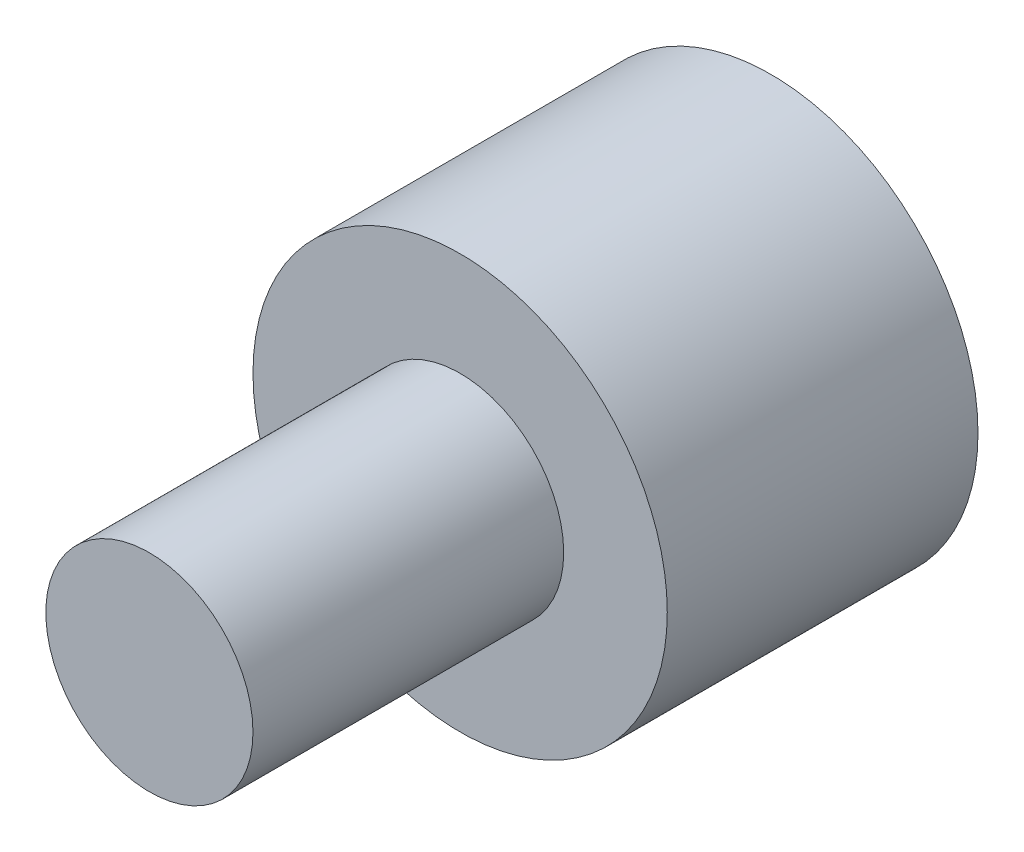
ISO-10303-21;
HEADER;
FILE_DESCRIPTION(('STEP AP214'),'2;1');
FILE_NAME('part.step','',(''),(''),'','','');
FILE_SCHEMA(('AUTOMOTIVE_DESIGN { 1 0 10303 214 1 1 1 1 }'));
ENDSEC;
DATA;
#1=APPLICATION_CONTEXT('core data for automotive mechanical design processes');
#2=APPLICATION_PROTOCOL_DEFINITION('international standard','automotive_design',2000,#1);
#3=PRODUCT_CONTEXT('',#1,'mechanical');
#4=PRODUCT('Part','Part','',(#3));
#5=PRODUCT_RELATED_PRODUCT_CATEGORY('part','',(#4));
#6=PRODUCT_DEFINITION_FORMATION('','',#4);
#7=PRODUCT_DEFINITION_CONTEXT('part definition',#1,'design');
#8=PRODUCT_DEFINITION('design','',#6,#7);
#9=PRODUCT_DEFINITION_SHAPE('','',#8);
#10=(LENGTH_UNIT() NAMED_UNIT(*) SI_UNIT(.MILLI.,.METRE.));
#11=(NAMED_UNIT(*) PLANE_ANGLE_UNIT() SI_UNIT($,.RADIAN.));
#12=(NAMED_UNIT(*) SI_UNIT($,.STERADIAN.) SOLID_ANGLE_UNIT());
#13=UNCERTAINTY_MEASURE_WITH_UNIT(LENGTH_MEASURE(1.E-05),#10,'distance_accuracy_value','');
#14=(GEOMETRIC_REPRESENTATION_CONTEXT(3) GLOBAL_UNCERTAINTY_ASSIGNED_CONTEXT((#13)) GLOBAL_UNIT_ASSIGNED_CONTEXT((#10,
#11,#12)) REPRESENTATION_CONTEXT('',''));
#15=CARTESIAN_POINT('',(0.,0.,0.));
#16=DIRECTION('',(0.,0.,1.));
#17=DIRECTION('',(1.,0.,0.));
#18=AXIS2_PLACEMENT_3D('',#15,#16,#17);
#19=CARTESIAN_POINT('',(0.,0.,30.));
#20=DIRECTION('',(0.,0.,-1.));
#21=DIRECTION('',(-1.,0.,0.));
#22=AXIS2_PLACEMENT_3D('',#19,#20,#21);
#23=CYLINDRICAL_SURFACE('',#22,20.);
#24=CARTESIAN_POINT('',(0.,0.,30.));
#25=DIRECTION('',(0.,0.,1.));
#26=DIRECTION('',(1.,0.,0.));
#27=AXIS2_PLACEMENT_3D('',#24,#25,#26);
#28=CIRCLE('',#27,20.);
#29=CARTESIAN_POINT('',(20.,0.,30.));
#30=VERTEX_POINT('',#29);
#31=EDGE_CURVE('E47',#30,#30,#28,.T.);
#32=ORIENTED_EDGE('',*,*,#31,.F.);
#33=EDGE_LOOP('',(#32));
#34=FACE_BOUND('',#33,.T.);
#35=CARTESIAN_POINT('',(0.,0.,0.));
#36=DIRECTION('',(0.,0.,1.));
#37=DIRECTION('',(1.,0.,0.));
#38=AXIS2_PLACEMENT_3D('',#35,#36,#37);
#39=CIRCLE('',#38,20.);
#40=CARTESIAN_POINT('',(20.,0.,0.));
#41=VERTEX_POINT('',#40);
#42=EDGE_CURVE('E42',#41,#41,#39,.T.);
#43=ORIENTED_EDGE('',*,*,#42,.T.);
#44=EDGE_LOOP('',(#43));
#45=FACE_BOUND('',#44,.T.);
#46=ADVANCED_FACE('F39',(#34,#45),#23,.T.);
#47=CARTESIAN_POINT('',(0.,0.,30.));
#48=DIRECTION('',(0.,0.,1.));
#49=DIRECTION('',(1.,0.,0.));
#50=AXIS2_PLACEMENT_3D('',#47,#48,#49);
#51=PLANE('',#50);
#52=CARTESIAN_POINT('',(0.,0.,30.));
#53=DIRECTION('',(0.,0.,1.));
#54=DIRECTION('',(1.,0.,0.));
#55=AXIS2_PLACEMENT_3D('',#52,#53,#54);
#56=CIRCLE('',#55,10.);
#57=CARTESIAN_POINT('',(10.,0.,30.));
#58=VERTEX_POINT('',#57);
#59=EDGE_CURVE('E10',#58,#58,#56,.T.);
#60=ORIENTED_EDGE('',*,*,#59,.F.);
#61=EDGE_LOOP('',(#60));
#62=FACE_BOUND('',#61,.T.);
#63=ORIENTED_EDGE('',*,*,#31,.T.);
#64=EDGE_LOOP('',(#63));
#65=FACE_BOUND('',#64,.T.);
#66=ADVANCED_FACE('F67',(#62,#65),#51,.T.);
#67=CARTESIAN_POINT('',(0.,0.,0.));
#68=DIRECTION('',(0.,0.,1.));
#69=DIRECTION('',(1.,0.,0.));
#70=AXIS2_PLACEMENT_3D('',#67,#68,#69);
#71=PLANE('',#70);
#72=ORIENTED_EDGE('',*,*,#42,.F.);
#73=EDGE_LOOP('',(#72));
#74=FACE_BOUND('',#73,.T.);
#75=ADVANCED_FACE('F64',(#74),#71,.F.);
#76=CARTESIAN_POINT('',(0.,0.,60.));
#77=DIRECTION('',(0.,0.,-1.));
#78=DIRECTION('',(-1.,0.,0.));
#79=AXIS2_PLACEMENT_3D('',#76,#77,#78);
#80=CYLINDRICAL_SURFACE('',#79,10.);
#81=CARTESIAN_POINT('',(0.,0.,60.));
#82=DIRECTION('',(0.,0.,1.));
#83=DIRECTION('',(1.,0.,0.));
#84=AXIS2_PLACEMENT_3D('',#81,#82,#83);
#85=CIRCLE('',#84,10.);
#86=CARTESIAN_POINT('',(10.,0.,60.));
#87=VERTEX_POINT('',#86);
#88=EDGE_CURVE('E54',#87,#87,#85,.T.);
#89=ORIENTED_EDGE('',*,*,#88,.F.);
#90=EDGE_LOOP('',(#89));
#91=FACE_BOUND('',#90,.T.);
#92=ORIENTED_EDGE('',*,*,#59,.T.);
#93=EDGE_LOOP('',(#92));
#94=FACE_BOUND('',#93,.T.);
#95=ADVANCED_FACE('F66',(#91,#94),#80,.T.);
#96=CARTESIAN_POINT('',(0.,0.,60.));
#97=DIRECTION('',(0.,0.,1.));
#98=DIRECTION('',(1.,0.,0.));
#99=AXIS2_PLACEMENT_3D('',#96,#97,#98);
#100=PLANE('',#99);
#101=ORIENTED_EDGE('',*,*,#88,.T.);
#102=EDGE_LOOP('',(#101));
#103=FACE_BOUND('',#102,.T.);
#104=ADVANCED_FACE('F72',(#103),#100,.T.);
#105=CLOSED_SHELL('',(#46,#66,#75,#95,#104));
#106=MANIFOLD_SOLID_BREP('B2',#105);
#107=ADVANCED_BREP_SHAPE_REPRESENTATION('',(#18,#106),#14);
#108=SHAPE_DEFINITION_REPRESENTATION(#9,#107);
ENDSEC;
END-ISO-10303-21;
